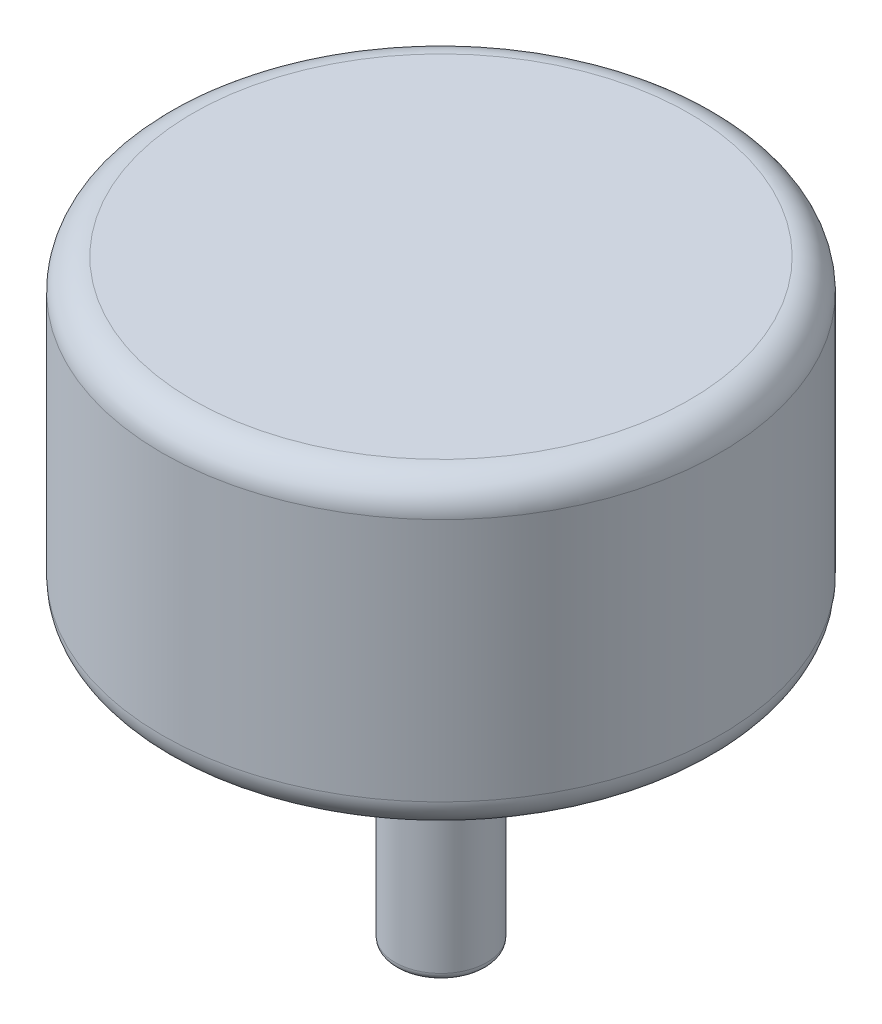
ISO-10303-21;
HEADER;
FILE_DESCRIPTION(('STEP AP214'),'2;1');
FILE_NAME('part.step','',(''),(''),'','','');
FILE_SCHEMA(('AUTOMOTIVE_DESIGN { 1 0 10303 214 1 1 1 1 }'));
ENDSEC;
DATA;
#1=APPLICATION_CONTEXT('core data for automotive mechanical design processes');
#2=APPLICATION_PROTOCOL_DEFINITION('international standard','automotive_design',2000,#1);
#3=PRODUCT_CONTEXT('',#1,'mechanical');
#4=PRODUCT('Part','Part','',(#3));
#5=PRODUCT_RELATED_PRODUCT_CATEGORY('part','',(#4));
#6=PRODUCT_DEFINITION_FORMATION('','',#4);
#7=PRODUCT_DEFINITION_CONTEXT('part definition',#1,'design');
#8=PRODUCT_DEFINITION('design','',#6,#7);
#9=PRODUCT_DEFINITION_SHAPE('','',#8);
#10=(LENGTH_UNIT() NAMED_UNIT(*) SI_UNIT(.MILLI.,.METRE.));
#11=(NAMED_UNIT(*) PLANE_ANGLE_UNIT() SI_UNIT($,.RADIAN.));
#12=(NAMED_UNIT(*) SI_UNIT($,.STERADIAN.) SOLID_ANGLE_UNIT());
#13=UNCERTAINTY_MEASURE_WITH_UNIT(LENGTH_MEASURE(1.E-05),#10,'distance_accuracy_value','');
#14=(GEOMETRIC_REPRESENTATION_CONTEXT(3) GLOBAL_UNCERTAINTY_ASSIGNED_CONTEXT((#13)) GLOBAL_UNIT_ASSIGNED_CONTEXT((#10,
#11,#12)) REPRESENTATION_CONTEXT('',''));
#15=CARTESIAN_POINT('',(0.,0.,0.));
#16=DIRECTION('',(0.,0.,1.));
#17=DIRECTION('',(1.,0.,0.));
#18=AXIS2_PLACEMENT_3D('',#15,#16,#17);
#19=CARTESIAN_POINT('',(0.,20.,0.));
#20=DIRECTION('',(0.,-1.,0.));
#21=DIRECTION('',(0.,0.,-1.));
#22=AXIS2_PLACEMENT_3D('',#19,#20,#21);
#23=CYLINDRICAL_SURFACE('',#22,18.25);
#24=CARTESIAN_POINT('',(0.,2.,0.));
#25=DIRECTION('',(0.,1.,0.));
#26=DIRECTION('',(0.,0.,1.));
#27=AXIS2_PLACEMENT_3D('',#24,#25,#26);
#28=CIRCLE('',#27,18.25);
#29=CARTESIAN_POINT('',(0.,2.,18.25));
#30=VERTEX_POINT('',#29);
#31=EDGE_CURVE('E56',#30,#30,#28,.T.);
#32=ORIENTED_EDGE('',*,*,#31,.T.);
#33=EDGE_LOOP('',(#32));
#34=FACE_BOUND('',#33,.T.);
#35=CARTESIAN_POINT('',(0.,18.,0.));
#36=DIRECTION('',(0.,1.,0.));
#37=DIRECTION('',(0.,0.,1.));
#38=AXIS2_PLACEMENT_3D('',#35,#36,#37);
#39=CIRCLE('',#38,18.25);
#40=CARTESIAN_POINT('',(0.,18.,18.25));
#41=VERTEX_POINT('',#40);
#42=EDGE_CURVE('E59',#41,#41,#39,.F.);
#43=ORIENTED_EDGE('',*,*,#42,.T.);
#44=EDGE_LOOP('',(#43));
#45=FACE_BOUND('',#44,.T.);
#46=ADVANCED_FACE('F32',(#34,#45),#23,.T.);
#47=CARTESIAN_POINT('',(0.,20.,0.));
#48=DIRECTION('',(0.,1.,0.));
#49=DIRECTION('',(0.,0.,1.));
#50=AXIS2_PLACEMENT_3D('',#47,#48,#49);
#51=PLANE('',#50);
#52=CARTESIAN_POINT('',(0.,20.,0.));
#53=DIRECTION('',(0.,1.,0.));
#54=DIRECTION('',(0.,0.,1.));
#55=AXIS2_PLACEMENT_3D('',#52,#53,#54);
#56=CIRCLE('',#55,16.25);
#57=CARTESIAN_POINT('',(0.,20.,16.25));
#58=VERTEX_POINT('',#57);
#59=EDGE_CURVE('E43',#58,#58,#56,.T.);
#60=ORIENTED_EDGE('',*,*,#59,.T.);
#61=EDGE_LOOP('',(#60));
#62=FACE_BOUND('',#61,.T.);
#63=ADVANCED_FACE('F85',(#62),#51,.T.);
#64=CARTESIAN_POINT('',(0.,0.,0.));
#65=DIRECTION('',(0.,1.,0.));
#66=DIRECTION('',(0.,0.,1.));
#67=AXIS2_PLACEMENT_3D('',#64,#65,#66);
#68=PLANE('',#67);
#69=CARTESIAN_POINT('',(0.,0.,0.));
#70=DIRECTION('',(0.,1.,0.));
#71=DIRECTION('',(0.,0.,1.));
#72=AXIS2_PLACEMENT_3D('',#69,#70,#71);
#73=CIRCLE('',#72,10.);
#74=CARTESIAN_POINT('',(0.,0.,10.));
#75=VERTEX_POINT('',#74);
#76=EDGE_CURVE('E52',#75,#75,#73,.T.);
#77=ORIENTED_EDGE('',*,*,#76,.T.);
#78=EDGE_LOOP('',(#77));
#79=FACE_BOUND('',#78,.T.);
#80=CARTESIAN_POINT('',(0.,0.,0.));
#81=DIRECTION('',(0.,1.,0.));
#82=DIRECTION('',(0.,0.,1.));
#83=AXIS2_PLACEMENT_3D('',#80,#81,#82);
#84=CIRCLE('',#83,16.25);
#85=CARTESIAN_POINT('',(0.,0.,16.25));
#86=VERTEX_POINT('',#85);
#87=EDGE_CURVE('E47',#86,#86,#84,.F.);
#88=ORIENTED_EDGE('',*,*,#87,.T.);
#89=EDGE_LOOP('',(#88));
#90=FACE_BOUND('',#89,.T.);
#91=ADVANCED_FACE('F91',(#79,#90),#68,.F.);
#92=CARTESIAN_POINT('',(0.,2.,0.));
#93=DIRECTION('',(0.,1.,0.));
#94=DIRECTION('',(0.,0.,1.));
#95=AXIS2_PLACEMENT_3D('',#92,#93,#94);
#96=TOROIDAL_SURFACE('',#95,16.25,2.);
#97=ORIENTED_EDGE('',*,*,#87,.F.);
#98=EDGE_LOOP('',(#97));
#99=FACE_BOUND('',#98,.T.);
#100=ORIENTED_EDGE('',*,*,#31,.F.);
#101=EDGE_LOOP('',(#100));
#102=FACE_BOUND('',#101,.T.);
#103=ADVANCED_FACE('F97',(#99,#102),#96,.T.);
#104=CARTESIAN_POINT('',(0.,18.,0.));
#105=DIRECTION('',(0.,1.,0.));
#106=DIRECTION('',(0.,0.,1.));
#107=AXIS2_PLACEMENT_3D('',#104,#105,#106);
#108=TOROIDAL_SURFACE('',#107,16.25,2.);
#109=ORIENTED_EDGE('',*,*,#42,.F.);
#110=EDGE_LOOP('',(#109));
#111=FACE_BOUND('',#110,.T.);
#112=ORIENTED_EDGE('',*,*,#59,.F.);
#113=EDGE_LOOP('',(#112));
#114=FACE_BOUND('',#113,.T.);
#115=ADVANCED_FACE('F82',(#111,#114),#108,.T.);
#116=CARTESIAN_POINT('',(0.,-1.6,0.));
#117=DIRECTION('',(0.,1.,0.));
#118=DIRECTION('',(0.,0.,1.));
#119=AXIS2_PLACEMENT_3D('',#116,#117,#118);
#120=CYLINDRICAL_SURFACE('',#119,10.);
#121=CARTESIAN_POINT('',(0.,-1.6,0.));
#122=DIRECTION('',(0.,1.,0.));
#123=DIRECTION('',(0.,0.,1.));
#124=AXIS2_PLACEMENT_3D('',#121,#122,#123);
#125=CIRCLE('',#124,10.);
#126=CARTESIAN_POINT('',(0.,-1.6,10.));
#127=VERTEX_POINT('',#126);
#128=EDGE_CURVE('E62',#127,#127,#125,.T.);
#129=ORIENTED_EDGE('',*,*,#128,.T.);
#130=EDGE_LOOP('',(#129));
#131=FACE_BOUND('',#130,.T.);
#132=ORIENTED_EDGE('',*,*,#76,.F.);
#133=EDGE_LOOP('',(#132));
#134=FACE_BOUND('',#133,.T.);
#135=ADVANCED_FACE('F68',(#131,#134),#120,.T.);
#136=CARTESIAN_POINT('',(0.,-1.6,0.));
#137=DIRECTION('',(0.,1.,0.));
#138=DIRECTION('',(0.,0.,1.));
#139=AXIS2_PLACEMENT_3D('',#136,#137,#138);
#140=PLANE('',#139);
#141=CARTESIAN_POINT('',(0.,-1.6,0.));
#142=DIRECTION('',(0.,1.,0.));
#143=DIRECTION('',(0.,0.,1.));
#144=AXIS2_PLACEMENT_3D('',#141,#142,#143);
#145=CIRCLE('',#144,3.);
#146=CARTESIAN_POINT('',(0.,-1.6,3.));
#147=VERTEX_POINT('',#146);
#148=EDGE_CURVE('E50',#147,#147,#145,.T.);
#149=ORIENTED_EDGE('',*,*,#148,.T.);
#150=EDGE_LOOP('',(#149));
#151=FACE_BOUND('',#150,.T.);
#152=ORIENTED_EDGE('',*,*,#128,.F.);
#153=EDGE_LOOP('',(#152));
#154=FACE_BOUND('',#153,.T.);
#155=ADVANCED_FACE('F71',(#151,#154),#140,.F.);
#156=CARTESIAN_POINT('',(0.,-19.,0.));
#157=DIRECTION('',(0.,1.,0.));
#158=DIRECTION('',(0.,0.,1.));
#159=AXIS2_PLACEMENT_3D('',#156,#157,#158);
#160=CYLINDRICAL_SURFACE('',#159,3.);
#161=CARTESIAN_POINT('',(0.,-18.5,0.));
#162=DIRECTION('',(0.,1.,0.));
#163=DIRECTION('',(0.,0.,1.));
#164=AXIS2_PLACEMENT_3D('',#161,#162,#163);
#165=CIRCLE('',#164,3.);
#166=CARTESIAN_POINT('',(0.,-18.5,3.));
#167=VERTEX_POINT('',#166);
#168=EDGE_CURVE('E39',#167,#167,#165,.T.);
#169=ORIENTED_EDGE('',*,*,#168,.T.);
#170=EDGE_LOOP('',(#169));
#171=FACE_BOUND('',#170,.T.);
#172=ORIENTED_EDGE('',*,*,#148,.F.);
#173=EDGE_LOOP('',(#172));
#174=FACE_BOUND('',#173,.T.);
#175=ADVANCED_FACE('F73',(#171,#174),#160,.T.);
#176=CARTESIAN_POINT('',(0.,-19.,0.));
#177=DIRECTION('',(0.,1.,0.));
#178=DIRECTION('',(0.,0.,1.));
#179=AXIS2_PLACEMENT_3D('',#176,#177,#178);
#180=PLANE('',#179);
#181=CARTESIAN_POINT('',(0.,-19.,0.));
#182=DIRECTION('',(0.,1.,0.));
#183=DIRECTION('',(0.,0.,1.));
#184=AXIS2_PLACEMENT_3D('',#181,#182,#183);
#185=CIRCLE('',#184,2.5);
#186=CARTESIAN_POINT('',(0.,-19.,2.5));
#187=VERTEX_POINT('',#186);
#188=EDGE_CURVE('E10',#187,#187,#185,.F.);
#189=ORIENTED_EDGE('',*,*,#188,.T.);
#190=EDGE_LOOP('',(#189));
#191=FACE_BOUND('',#190,.T.);
#192=ADVANCED_FACE('F80',(#191),#180,.F.);
#193=CARTESIAN_POINT('',(0.,-18.5,0.));
#194=DIRECTION('',(0.,1.,0.));
#195=DIRECTION('',(0.,0.,1.));
#196=AXIS2_PLACEMENT_3D('',#193,#194,#195);
#197=TOROIDAL_SURFACE('',#196,2.5,0.5);
#198=ORIENTED_EDGE('',*,*,#188,.F.);
#199=EDGE_LOOP('',(#198));
#200=FACE_BOUND('',#199,.T.);
#201=ORIENTED_EDGE('',*,*,#168,.F.);
#202=EDGE_LOOP('',(#201));
#203=FACE_BOUND('',#202,.T.);
#204=ADVANCED_FACE('F34',(#200,#203),#197,.T.);
#205=CLOSED_SHELL('',(#46,#63,#91,#103,#115,#135,#155,#175,#192,#204));
#206=MANIFOLD_SOLID_BREP('B2',#205);
#207=ADVANCED_BREP_SHAPE_REPRESENTATION('',(#18,#206),#14);
#208=SHAPE_DEFINITION_REPRESENTATION(#9,#207);
ENDSEC;
END-ISO-10303-21;
